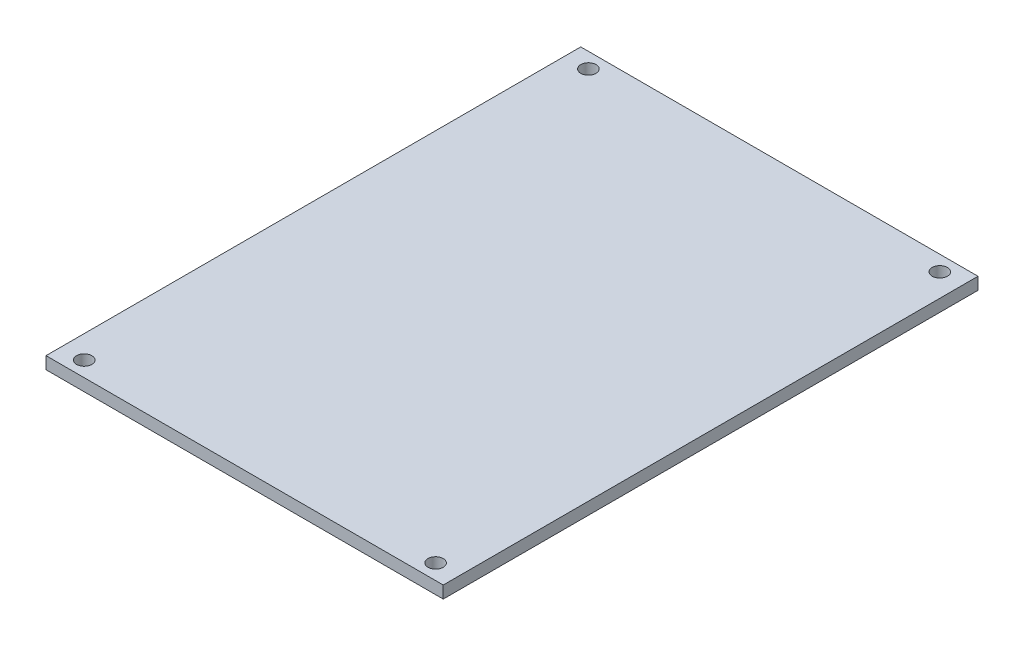
ISO-10303-21;
HEADER;
FILE_DESCRIPTION(('STEP AP214'),'2;1');
FILE_NAME('part.step','',(''),(''),'','','');
FILE_SCHEMA(('AUTOMOTIVE_DESIGN { 1 0 10303 214 1 1 1 1 }'));
ENDSEC;
DATA;
#1=APPLICATION_CONTEXT('core data for automotive mechanical design processes');
#2=APPLICATION_PROTOCOL_DEFINITION('international standard','automotive_design',2000,#1);
#3=PRODUCT_CONTEXT('',#1,'mechanical');
#4=PRODUCT('Part','Part','',(#3));
#5=PRODUCT_RELATED_PRODUCT_CATEGORY('part','',(#4));
#6=PRODUCT_DEFINITION_FORMATION('','',#4);
#7=PRODUCT_DEFINITION_CONTEXT('part definition',#1,'design');
#8=PRODUCT_DEFINITION('design','',#6,#7);
#9=PRODUCT_DEFINITION_SHAPE('','',#8);
#10=(LENGTH_UNIT() NAMED_UNIT(*) SI_UNIT(.MILLI.,.METRE.));
#11=(NAMED_UNIT(*) PLANE_ANGLE_UNIT() SI_UNIT($,.RADIAN.));
#12=(NAMED_UNIT(*) SI_UNIT($,.STERADIAN.) SOLID_ANGLE_UNIT());
#13=UNCERTAINTY_MEASURE_WITH_UNIT(LENGTH_MEASURE(1.E-05),#10,'distance_accuracy_value','');
#14=(GEOMETRIC_REPRESENTATION_CONTEXT(3) GLOBAL_UNCERTAINTY_ASSIGNED_CONTEXT((#13)) GLOBAL_UNIT_ASSIGNED_CONTEXT((#10,
#11,#12)) REPRESENTATION_CONTEXT('',''));
#15=CARTESIAN_POINT('',(0.,0.,0.));
#16=DIRECTION('',(0.,0.,1.));
#17=DIRECTION('',(1.,0.,0.));
#18=AXIS2_PLACEMENT_3D('',#15,#16,#17);
#19=CARTESIAN_POINT('',(0.,1.6,0.));
#20=DIRECTION('',(0.,1.,0.));
#21=DIRECTION('',(0.,0.,1.));
#22=AXIS2_PLACEMENT_3D('',#19,#20,#21);
#23=PLANE('',#22);
#24=CARTESIAN_POINT('',(49.,1.6,-68.));
#25=DIRECTION('',(0.,1.,0.));
#26=DIRECTION('',(0.,0.,1.));
#27=AXIS2_PLACEMENT_3D('',#24,#25,#26);
#28=CIRCLE('',#27,0.999999999999998);
#29=CARTESIAN_POINT('',(49.,1.6,-67.));
#30=VERTEX_POINT('',#29);
#31=EDGE_CURVE('E125',#30,#30,#28,.T.);
#32=ORIENTED_EDGE('',*,*,#31,.F.);
#33=EDGE_LOOP('',(#32));
#34=FACE_BOUND('',#33,.T.);
#35=CARTESIAN_POINT('',(3.00000000000001,1.6,-2.));
#36=DIRECTION('',(0.,1.,0.));
#37=DIRECTION('',(0.,0.,1.));
#38=AXIS2_PLACEMENT_3D('',#35,#36,#37);
#39=CIRCLE('',#38,1.);
#40=CARTESIAN_POINT('',(3.00000000000001,1.6,-1.));
#41=VERTEX_POINT('',#40);
#42=EDGE_CURVE('E104',#41,#41,#39,.T.);
#43=ORIENTED_EDGE('',*,*,#42,.F.);
#44=EDGE_LOOP('',(#43));
#45=FACE_BOUND('',#44,.T.);
#46=DIRECTION('',(0.,0.,1.));
#47=VECTOR('',#46,1.);
#48=CARTESIAN_POINT('',(0.,1.6,-70.));
#49=LINE('',#48,#47);
#50=CARTESIAN_POINT('',(0.,1.6,-70.));
#51=VERTEX_POINT('',#50);
#52=CARTESIAN_POINT('',(0.,1.6,0.));
#53=VERTEX_POINT('',#52);
#54=EDGE_CURVE('E89',#51,#53,#49,.T.);
#55=ORIENTED_EDGE('',*,*,#54,.T.);
#56=DIRECTION('',(1.,0.,0.));
#57=VECTOR('',#56,1.);
#58=CARTESIAN_POINT('',(0.,1.6,0.));
#59=LINE('',#58,#57);
#60=CARTESIAN_POINT('',(52.,1.6,0.));
#61=VERTEX_POINT('',#60);
#62=EDGE_CURVE('E84',#53,#61,#59,.T.);
#63=ORIENTED_EDGE('',*,*,#62,.T.);
#64=DIRECTION('',(0.,0.,-1.));
#65=VECTOR('',#64,1.);
#66=CARTESIAN_POINT('',(52.,1.6,-70.));
#67=LINE('',#66,#65);
#68=CARTESIAN_POINT('',(52.,1.6,-70.));
#69=VERTEX_POINT('',#68);
#70=EDGE_CURVE('E87',#61,#69,#67,.T.);
#71=ORIENTED_EDGE('',*,*,#70,.T.);
#72=DIRECTION('',(-1.,0.,0.));
#73=VECTOR('',#72,1.);
#74=CARTESIAN_POINT('',(0.,1.6,-70.));
#75=LINE('',#74,#73);
#76=EDGE_CURVE('E54',#69,#51,#75,.T.);
#77=ORIENTED_EDGE('',*,*,#76,.T.);
#78=EDGE_LOOP('',(#55,#63,#71,#77));
#79=FACE_BOUND('',#78,.T.);
#80=CARTESIAN_POINT('',(49.,1.6,-2.));
#81=DIRECTION('',(0.,1.,0.));
#82=DIRECTION('',(0.,0.,1.));
#83=AXIS2_PLACEMENT_3D('',#80,#81,#82);
#84=CIRCLE('',#83,0.999999999999998);
#85=CARTESIAN_POINT('',(49.,1.6,-1.));
#86=VERTEX_POINT('',#85);
#87=EDGE_CURVE('E119',#86,#86,#84,.T.);
#88=ORIENTED_EDGE('',*,*,#87,.F.);
#89=EDGE_LOOP('',(#88));
#90=FACE_BOUND('',#89,.T.);
#91=CARTESIAN_POINT('',(3.00000000000001,1.6,-68.));
#92=DIRECTION('',(0.,1.,0.));
#93=DIRECTION('',(0.,0.,1.));
#94=AXIS2_PLACEMENT_3D('',#91,#92,#93);
#95=CIRCLE('',#94,1.);
#96=CARTESIAN_POINT('',(3.00000000000001,1.6,-67.));
#97=VERTEX_POINT('',#96);
#98=EDGE_CURVE('E131',#97,#97,#95,.T.);
#99=ORIENTED_EDGE('',*,*,#98,.F.);
#100=EDGE_LOOP('',(#99));
#101=FACE_BOUND('',#100,.T.);
#102=ADVANCED_FACE('F37',(#34,#45,#79,#90,#101),#23,.T.);
#103=CARTESIAN_POINT('',(0.,0.,0.));
#104=DIRECTION('',(0.,1.,0.));
#105=DIRECTION('',(0.,0.,1.));
#106=AXIS2_PLACEMENT_3D('',#103,#104,#105);
#107=PLANE('',#106);
#108=DIRECTION('',(0.,0.,1.));
#109=VECTOR('',#108,1.);
#110=CARTESIAN_POINT('',(0.,0.,-70.));
#111=LINE('',#110,#109);
#112=CARTESIAN_POINT('',(0.,0.,-70.));
#113=VERTEX_POINT('',#112);
#114=CARTESIAN_POINT('',(0.,0.,0.));
#115=VERTEX_POINT('',#114);
#116=EDGE_CURVE('E101',#113,#115,#111,.T.);
#117=ORIENTED_EDGE('',*,*,#116,.F.);
#118=DIRECTION('',(-1.,0.,0.));
#119=VECTOR('',#118,1.);
#120=CARTESIAN_POINT('',(0.,0.,-70.));
#121=LINE('',#120,#119);
#122=CARTESIAN_POINT('',(52.,0.,-70.));
#123=VERTEX_POINT('',#122);
#124=EDGE_CURVE('E77',#123,#113,#121,.T.);
#125=ORIENTED_EDGE('',*,*,#124,.F.);
#126=DIRECTION('',(0.,0.,-1.));
#127=VECTOR('',#126,1.);
#128=CARTESIAN_POINT('',(52.,0.,-70.));
#129=LINE('',#128,#127);
#130=CARTESIAN_POINT('',(52.,0.,0.));
#131=VERTEX_POINT('',#130);
#132=EDGE_CURVE('E71',#131,#123,#129,.T.);
#133=ORIENTED_EDGE('',*,*,#132,.F.);
#134=DIRECTION('',(1.,0.,0.));
#135=VECTOR('',#134,1.);
#136=CARTESIAN_POINT('',(0.,0.,0.));
#137=LINE('',#136,#135);
#138=EDGE_CURVE('E93',#115,#131,#137,.T.);
#139=ORIENTED_EDGE('',*,*,#138,.F.);
#140=EDGE_LOOP('',(#117,#125,#133,#139));
#141=FACE_BOUND('',#140,.T.);
#142=CARTESIAN_POINT('',(3.00000000000001,0.,-2.));
#143=DIRECTION('',(0.,1.,0.));
#144=DIRECTION('',(0.,0.,1.));
#145=AXIS2_PLACEMENT_3D('',#142,#143,#144);
#146=CIRCLE('',#145,1.);
#147=CARTESIAN_POINT('',(3.00000000000001,0.,-1.));
#148=VERTEX_POINT('',#147);
#149=EDGE_CURVE('E116',#148,#148,#146,.T.);
#150=ORIENTED_EDGE('',*,*,#149,.T.);
#151=EDGE_LOOP('',(#150));
#152=FACE_BOUND('',#151,.T.);
#153=CARTESIAN_POINT('',(49.,0.,-2.));
#154=DIRECTION('',(0.,1.,0.));
#155=DIRECTION('',(0.,0.,1.));
#156=AXIS2_PLACEMENT_3D('',#153,#154,#155);
#157=CIRCLE('',#156,0.999999999999998);
#158=CARTESIAN_POINT('',(49.,0.,-1.));
#159=VERTEX_POINT('',#158);
#160=EDGE_CURVE('E122',#159,#159,#157,.T.);
#161=ORIENTED_EDGE('',*,*,#160,.T.);
#162=EDGE_LOOP('',(#161));
#163=FACE_BOUND('',#162,.T.);
#164=CARTESIAN_POINT('',(49.,0.,-68.));
#165=DIRECTION('',(0.,1.,0.));
#166=DIRECTION('',(0.,0.,1.));
#167=AXIS2_PLACEMENT_3D('',#164,#165,#166);
#168=CIRCLE('',#167,0.999999999999998);
#169=CARTESIAN_POINT('',(49.,0.,-67.));
#170=VERTEX_POINT('',#169);
#171=EDGE_CURVE('E128',#170,#170,#168,.T.);
#172=ORIENTED_EDGE('',*,*,#171,.T.);
#173=EDGE_LOOP('',(#172));
#174=FACE_BOUND('',#173,.T.);
#175=CARTESIAN_POINT('',(3.00000000000001,0.,-68.));
#176=DIRECTION('',(0.,1.,0.));
#177=DIRECTION('',(0.,0.,1.));
#178=AXIS2_PLACEMENT_3D('',#175,#176,#177);
#179=CIRCLE('',#178,1.);
#180=CARTESIAN_POINT('',(3.00000000000001,0.,-67.));
#181=VERTEX_POINT('',#180);
#182=EDGE_CURVE('E134',#181,#181,#179,.T.);
#183=ORIENTED_EDGE('',*,*,#182,.T.);
#184=EDGE_LOOP('',(#183));
#185=FACE_BOUND('',#184,.T.);
#186=ADVANCED_FACE('F112',(#141,#152,#163,#174,#185),#107,.F.);
#187=CARTESIAN_POINT('',(0.,1.6,-70.));
#188=DIRECTION('',(1.,0.,0.));
#189=DIRECTION('',(0.,0.,-1.));
#190=AXIS2_PLACEMENT_3D('',#187,#188,#189);
#191=PLANE('',#190);
#192=ORIENTED_EDGE('',*,*,#116,.T.);
#193=DIRECTION('',(0.,-1.,0.));
#194=VECTOR('',#193,1.);
#195=CARTESIAN_POINT('',(0.,1.6,0.));
#196=LINE('',#195,#194);
#197=EDGE_CURVE('E11',#53,#115,#196,.T.);
#198=ORIENTED_EDGE('',*,*,#197,.F.);
#199=ORIENTED_EDGE('',*,*,#54,.F.);
#200=DIRECTION('',(0.,-1.,0.));
#201=VECTOR('',#200,1.);
#202=CARTESIAN_POINT('',(0.,1.6,-70.));
#203=LINE('',#202,#201);
#204=EDGE_CURVE('E97',#51,#113,#203,.T.);
#205=ORIENTED_EDGE('',*,*,#204,.T.);
#206=EDGE_LOOP('',(#192,#198,#199,#205));
#207=FACE_BOUND('',#206,.T.);
#208=ADVANCED_FACE('F39',(#207),#191,.F.);
#209=CARTESIAN_POINT('',(0.,1.6,0.));
#210=DIRECTION('',(0.,0.,-1.));
#211=DIRECTION('',(-1.,0.,0.));
#212=AXIS2_PLACEMENT_3D('',#209,#210,#211);
#213=PLANE('',#212);
#214=ORIENTED_EDGE('',*,*,#138,.T.);
#215=DIRECTION('',(0.,-1.,0.));
#216=VECTOR('',#215,1.);
#217=CARTESIAN_POINT('',(52.,1.6,0.));
#218=LINE('',#217,#216);
#219=EDGE_CURVE('E46',#61,#131,#218,.T.);
#220=ORIENTED_EDGE('',*,*,#219,.F.);
#221=ORIENTED_EDGE('',*,*,#62,.F.);
#222=ORIENTED_EDGE('',*,*,#197,.T.);
#223=EDGE_LOOP('',(#214,#220,#221,#222));
#224=FACE_BOUND('',#223,.T.);
#225=ADVANCED_FACE('F92',(#224),#213,.F.);
#226=CARTESIAN_POINT('',(52.,1.6,-70.));
#227=DIRECTION('',(-1.,0.,0.));
#228=DIRECTION('',(0.,0.,1.));
#229=AXIS2_PLACEMENT_3D('',#226,#227,#228);
#230=PLANE('',#229);
#231=ORIENTED_EDGE('',*,*,#132,.T.);
#232=DIRECTION('',(0.,-1.,0.));
#233=VECTOR('',#232,1.);
#234=CARTESIAN_POINT('',(52.,1.6,-70.));
#235=LINE('',#234,#233);
#236=EDGE_CURVE('E94',#69,#123,#235,.T.);
#237=ORIENTED_EDGE('',*,*,#236,.F.);
#238=ORIENTED_EDGE('',*,*,#70,.F.);
#239=ORIENTED_EDGE('',*,*,#219,.T.);
#240=EDGE_LOOP('',(#231,#237,#238,#239));
#241=FACE_BOUND('',#240,.T.);
#242=ADVANCED_FACE('F95',(#241),#230,.F.);
#243=CARTESIAN_POINT('',(0.,1.6,-70.));
#244=DIRECTION('',(0.,0.,1.));
#245=DIRECTION('',(1.,0.,0.));
#246=AXIS2_PLACEMENT_3D('',#243,#244,#245);
#247=PLANE('',#246);
#248=ORIENTED_EDGE('',*,*,#124,.T.);
#249=ORIENTED_EDGE('',*,*,#204,.F.);
#250=ORIENTED_EDGE('',*,*,#76,.F.);
#251=ORIENTED_EDGE('',*,*,#236,.T.);
#252=EDGE_LOOP('',(#248,#249,#250,#251));
#253=FACE_BOUND('',#252,.T.);
#254=ADVANCED_FACE('F109',(#253),#247,.F.);
#255=CARTESIAN_POINT('',(3.00000000000001,1.6,-2.));
#256=DIRECTION('',(0.,-1.,0.));
#257=DIRECTION('',(0.,0.,-1.));
#258=AXIS2_PLACEMENT_3D('',#255,#256,#257);
#259=CYLINDRICAL_SURFACE('',#258,1.);
#260=ORIENTED_EDGE('',*,*,#42,.T.);
#261=EDGE_LOOP('',(#260));
#262=FACE_BOUND('',#261,.T.);
#263=ORIENTED_EDGE('',*,*,#149,.F.);
#264=EDGE_LOOP('',(#263));
#265=FACE_BOUND('',#264,.T.);
#266=ADVANCED_FACE('F153',(#262,#265),#259,.F.);
#267=CARTESIAN_POINT('',(49.,1.6,-2.));
#268=DIRECTION('',(0.,-1.,0.));
#269=DIRECTION('',(0.,0.,-1.));
#270=AXIS2_PLACEMENT_3D('',#267,#268,#269);
#271=CYLINDRICAL_SURFACE('',#270,0.999999999999998);
#272=ORIENTED_EDGE('',*,*,#87,.T.);
#273=EDGE_LOOP('',(#272));
#274=FACE_BOUND('',#273,.T.);
#275=ORIENTED_EDGE('',*,*,#160,.F.);
#276=EDGE_LOOP('',(#275));
#277=FACE_BOUND('',#276,.T.);
#278=ADVANCED_FACE('F199',(#274,#277),#271,.F.);
#279=CARTESIAN_POINT('',(49.,1.6,-68.));
#280=DIRECTION('',(0.,-1.,0.));
#281=DIRECTION('',(0.,0.,-1.));
#282=AXIS2_PLACEMENT_3D('',#279,#280,#281);
#283=CYLINDRICAL_SURFACE('',#282,0.999999999999998);
#284=ORIENTED_EDGE('',*,*,#31,.T.);
#285=EDGE_LOOP('',(#284));
#286=FACE_BOUND('',#285,.T.);
#287=ORIENTED_EDGE('',*,*,#171,.F.);
#288=EDGE_LOOP('',(#287));
#289=FACE_BOUND('',#288,.T.);
#290=ADVANCED_FACE('F207',(#286,#289),#283,.F.);
#291=CARTESIAN_POINT('',(3.00000000000001,1.6,-68.));
#292=DIRECTION('',(0.,-1.,0.));
#293=DIRECTION('',(0.,0.,-1.));
#294=AXIS2_PLACEMENT_3D('',#291,#292,#293);
#295=CYLINDRICAL_SURFACE('',#294,1.);
#296=ORIENTED_EDGE('',*,*,#98,.T.);
#297=EDGE_LOOP('',(#296));
#298=FACE_BOUND('',#297,.T.);
#299=ORIENTED_EDGE('',*,*,#182,.F.);
#300=EDGE_LOOP('',(#299));
#301=FACE_BOUND('',#300,.T.);
#302=ADVANCED_FACE('F140',(#298,#301),#295,.F.);
#303=CLOSED_SHELL('',(#102,#186,#208,#225,#242,#254,#266,#278,#290,#302));
#304=MANIFOLD_SOLID_BREP('B2',#303);
#305=ADVANCED_BREP_SHAPE_REPRESENTATION('',(#18,#304),#14);
#306=SHAPE_DEFINITION_REPRESENTATION(#9,#305);
ENDSEC;
END-ISO-10303-21;
